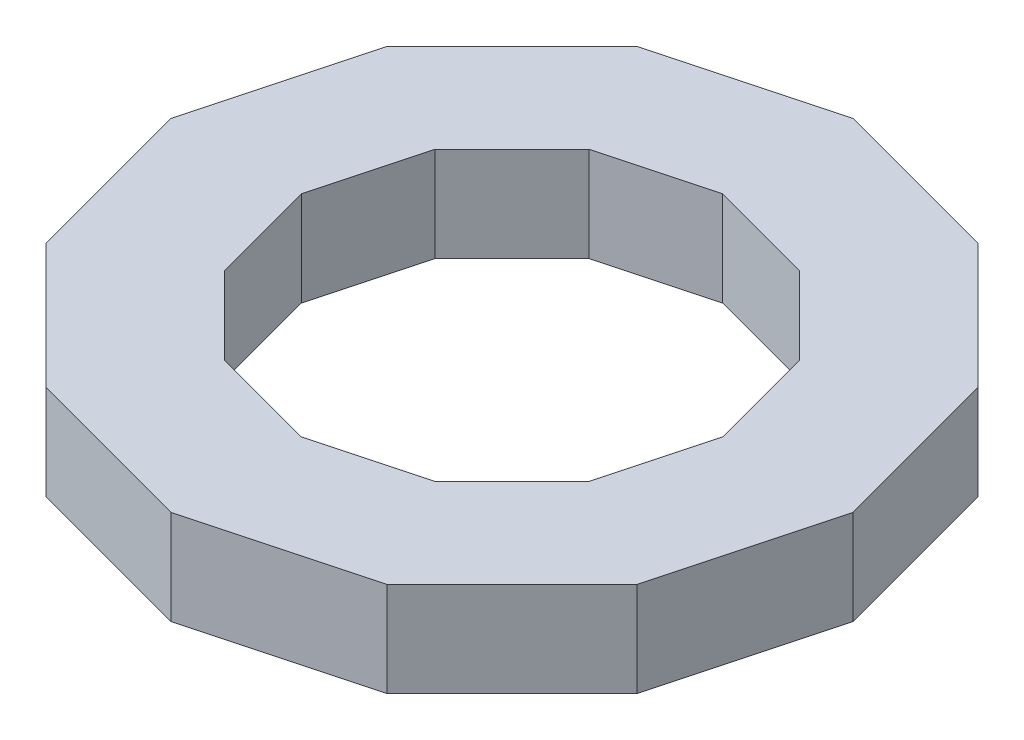
ISO-10303-21;
HEADER;
FILE_DESCRIPTION(('STEP AP214'),'2;1');
FILE_NAME('part.step','',(''),(''),'','','');
FILE_SCHEMA(('AUTOMOTIVE_DESIGN { 1 0 10303 214 1 1 1 1 }'));
ENDSEC;
DATA;
#1=APPLICATION_CONTEXT('core data for automotive mechanical design processes');
#2=APPLICATION_PROTOCOL_DEFINITION('international standard','automotive_design',2000,#1);
#3=PRODUCT_CONTEXT('',#1,'mechanical');
#4=PRODUCT('Part','Part','',(#3));
#5=PRODUCT_RELATED_PRODUCT_CATEGORY('part','',(#4));
#6=PRODUCT_DEFINITION_FORMATION('','',#4);
#7=PRODUCT_DEFINITION_CONTEXT('part definition',#1,'design');
#8=PRODUCT_DEFINITION('design','',#6,#7);
#9=PRODUCT_DEFINITION_SHAPE('','',#8);
#10=(LENGTH_UNIT() NAMED_UNIT(*) SI_UNIT(.MILLI.,.METRE.));
#11=(NAMED_UNIT(*) PLANE_ANGLE_UNIT() SI_UNIT($,.RADIAN.));
#12=(NAMED_UNIT(*) SI_UNIT($,.STERADIAN.) SOLID_ANGLE_UNIT());
#13=UNCERTAINTY_MEASURE_WITH_UNIT(LENGTH_MEASURE(1.E-05),#10,'distance_accuracy_value','');
#14=(GEOMETRIC_REPRESENTATION_CONTEXT(3) GLOBAL_UNCERTAINTY_ASSIGNED_CONTEXT((#13)) GLOBAL_UNIT_ASSIGNED_CONTEXT((#10,
#11,#12)) REPRESENTATION_CONTEXT('',''));
#15=CARTESIAN_POINT('',(0.,0.,0.));
#16=DIRECTION('',(0.,0.,1.));
#17=DIRECTION('',(1.,0.,0.));
#18=AXIS2_PLACEMENT_3D('',#15,#16,#17);
#19=CARTESIAN_POINT('',(0.,19.05,0.));
#20=DIRECTION('',(0.,1.,0.));
#21=DIRECTION('',(0.,0.,1.));
#22=AXIS2_PLACEMENT_3D('',#19,#20,#21);
#23=PLANE('',#22);
#24=DIRECTION('',(0.258819045102522,0.,-0.965925826289068));
#25=VECTOR('',#24,1.);
#26=CARTESIAN_POINT('',(59.4930395218329,19.05,34.3483223828394));
#27=LINE('',#26,#25);
#28=CARTESIAN_POINT('',(59.4930395218329,19.05,34.3483223828394));
#29=VERTEX_POINT('',#28);
#30=CARTESIAN_POINT('',(68.6966447656785,19.05,0.));
#31=VERTEX_POINT('',#30);
#32=EDGE_CURVE('E310',#29,#31,#27,.T.);
#33=ORIENTED_EDGE('',*,*,#32,.T.);
#34=DIRECTION('',(-0.258819045102519,0.,-0.965925826289069));
#35=VECTOR('',#34,1.);
#36=CARTESIAN_POINT('',(68.6966447656785,19.05,0.));
#37=LINE('',#36,#35);
#38=CARTESIAN_POINT('',(59.4930395218329,19.05,-34.3483223828392));
#39=VERTEX_POINT('',#38);
#40=EDGE_CURVE('E313',#31,#39,#37,.T.);
#41=ORIENTED_EDGE('',*,*,#40,.T.);
#42=DIRECTION('',(-0.707106781186547,0.,-0.707106781186548));
#43=VECTOR('',#42,1.);
#44=CARTESIAN_POINT('',(59.4930395218329,19.05,-34.3483223828392));
#45=LINE('',#44,#43);
#46=CARTESIAN_POINT('',(34.3483223828392,19.05,-59.493039521833));
#47=VERTEX_POINT('',#46);
#48=EDGE_CURVE('E317',#39,#47,#45,.T.);
#49=ORIENTED_EDGE('',*,*,#48,.T.);
#50=DIRECTION('',(-0.965925826289068,0.,-0.258819045102521));
#51=VECTOR('',#50,1.);
#52=CARTESIAN_POINT('',(34.3483223828392,19.05,-59.493039521833));
#53=LINE('',#52,#51);
#54=CARTESIAN_POINT('',(0.,19.05,-68.6966447656786));
#55=VERTEX_POINT('',#54);
#56=EDGE_CURVE('E319',#47,#55,#53,.T.);
#57=ORIENTED_EDGE('',*,*,#56,.T.);
#58=DIRECTION('',(-0.965925826289069,0.,0.25881904510252));
#59=VECTOR('',#58,1.);
#60=CARTESIAN_POINT('',(0.,19.05,-68.6966447656786));
#61=LINE('',#60,#59);
#62=CARTESIAN_POINT('',(-34.3483223828393,19.05,-59.493039521833));
#63=VERTEX_POINT('',#62);
#64=EDGE_CURVE('E322',#55,#63,#61,.T.);
#65=ORIENTED_EDGE('',*,*,#64,.T.);
#66=DIRECTION('',(-0.707106781186548,0.,0.707106781186547));
#67=VECTOR('',#66,1.);
#68=CARTESIAN_POINT('',(-34.3483223828393,19.05,-59.493039521833));
#69=LINE('',#68,#67);
#70=CARTESIAN_POINT('',(-59.4930395218329,19.05,-34.3483223828394));
#71=VERTEX_POINT('',#70);
#72=EDGE_CURVE('E325',#63,#71,#69,.T.);
#73=ORIENTED_EDGE('',*,*,#72,.T.);
#74=DIRECTION('',(-0.258819045102522,0.,0.965925826289068));
#75=VECTOR('',#74,1.);
#76=CARTESIAN_POINT('',(-59.4930395218329,19.05,-34.3483223828394));
#77=LINE('',#76,#75);
#78=CARTESIAN_POINT('',(-68.6966447656786,19.05,0.));
#79=VERTEX_POINT('',#78);
#80=EDGE_CURVE('E328',#71,#79,#77,.T.);
#81=ORIENTED_EDGE('',*,*,#80,.T.);
#82=DIRECTION('',(0.25881904510252,0.,0.965925826289069));
#83=VECTOR('',#82,1.);
#84=CARTESIAN_POINT('',(-68.6966447656786,19.05,0.));
#85=LINE('',#84,#83);
#86=CARTESIAN_POINT('',(-59.493039521833,19.05,34.3483223828392));
#87=VERTEX_POINT('',#86);
#88=EDGE_CURVE('E331',#79,#87,#85,.T.);
#89=ORIENTED_EDGE('',*,*,#88,.T.);
#90=DIRECTION('',(0.707106781186547,0.,0.707106781186548));
#91=VECTOR('',#90,1.);
#92=CARTESIAN_POINT('',(-59.493039521833,19.05,34.3483223828392));
#93=LINE('',#92,#91);
#94=CARTESIAN_POINT('',(-34.3483223828393,19.05,59.4930395218329));
#95=VERTEX_POINT('',#94);
#96=EDGE_CURVE('E333',#87,#95,#93,.T.);
#97=ORIENTED_EDGE('',*,*,#96,.T.);
#98=DIRECTION('',(0.965925826289068,0.,0.258819045102522));
#99=VECTOR('',#98,1.);
#100=CARTESIAN_POINT('',(-34.3483223828393,19.05,59.4930395218329));
#101=LINE('',#100,#99);
#102=CARTESIAN_POINT('',(-1.30936471077162E-13,19.05,68.6966447656786));
#103=VERTEX_POINT('',#102);
#104=EDGE_CURVE('E336',#95,#103,#101,.T.);
#105=ORIENTED_EDGE('',*,*,#104,.T.);
#106=DIRECTION('',(0.965925826289069,0.,-0.258819045102519));
#107=VECTOR('',#106,1.);
#108=CARTESIAN_POINT('',(-1.30936471077162E-13,19.05,68.6966447656786));
#109=LINE('',#108,#107);
#110=CARTESIAN_POINT('',(34.3483223828392,19.05,59.493039521833));
#111=VERTEX_POINT('',#110);
#112=EDGE_CURVE('E339',#103,#111,#109,.T.);
#113=ORIENTED_EDGE('',*,*,#112,.T.);
#114=DIRECTION('',(0.707106781186548,0.,-0.707106781186547));
#115=VECTOR('',#114,1.);
#116=CARTESIAN_POINT('',(34.3483223828392,19.05,59.493039521833));
#117=LINE('',#116,#115);
#118=EDGE_CURVE('E341',#111,#29,#117,.T.);
#119=ORIENTED_EDGE('',*,*,#118,.T.);
#120=EDGE_LOOP('',(#33,#41,#49,#57,#65,#73,#81,#89,#97,#105,#113,#119));
#121=FACE_BOUND('',#120,.T.);
#122=DIRECTION('',(-0.25881904510252,0.,-0.965925826289069));
#123=VECTOR('',#122,1.);
#124=CARTESIAN_POINT('',(42.4006297832624,19.05,0.));
#125=LINE('',#124,#123);
#126=CARTESIAN_POINT('',(42.4006297832624,19.05,0.));
#127=VERTEX_POINT('',#126);
#128=CARTESIAN_POINT('',(36.7200225287644,19.05,-21.2003148916311));
#129=VERTEX_POINT('',#128);
#130=EDGE_CURVE('E205',#127,#129,#125,.T.);
#131=ORIENTED_EDGE('',*,*,#130,.F.);
#132=DIRECTION('',(0.258819045102521,0.,-0.965925826289068));
#133=VECTOR('',#132,1.);
#134=CARTESIAN_POINT('',(36.7200225287643,19.05,21.2003148916312));
#135=LINE('',#134,#133);
#136=CARTESIAN_POINT('',(36.7200225287643,19.05,21.2003148916312));
#137=VERTEX_POINT('',#136);
#138=EDGE_CURVE('E196',#137,#127,#135,.T.);
#139=ORIENTED_EDGE('',*,*,#138,.F.);
#140=DIRECTION('',(0.707106781186548,0.,-0.707106781186547));
#141=VECTOR('',#140,1.);
#142=CARTESIAN_POINT('',(21.2003148916311,19.05,36.7200225287644));
#143=LINE('',#142,#141);
#144=CARTESIAN_POINT('',(21.2003148916312,19.05,36.7200225287644));
#145=VERTEX_POINT('',#144);
#146=EDGE_CURVE('E248',#145,#137,#143,.T.);
#147=ORIENTED_EDGE('',*,*,#146,.F.);
#148=DIRECTION('',(0.965925826289069,0.,-0.25881904510252));
#149=VECTOR('',#148,1.);
#150=CARTESIAN_POINT('',(0.,19.05,42.4006297832624));
#151=LINE('',#150,#149);
#152=CARTESIAN_POINT('',(0.,19.05,42.4006297832624));
#153=VERTEX_POINT('',#152);
#154=EDGE_CURVE('E245',#153,#145,#151,.T.);
#155=ORIENTED_EDGE('',*,*,#154,.F.);
#156=DIRECTION('',(0.965925826289068,0.,0.258819045102522));
#157=VECTOR('',#156,1.);
#158=CARTESIAN_POINT('',(-21.2003148916313,19.05,36.7200225287643));
#159=LINE('',#158,#157);
#160=CARTESIAN_POINT('',(-21.2003148916313,19.05,36.7200225287643));
#161=VERTEX_POINT('',#160);
#162=EDGE_CURVE('E242',#161,#153,#159,.T.);
#163=ORIENTED_EDGE('',*,*,#162,.F.);
#164=DIRECTION('',(0.707106781186547,0.,0.707106781186548));
#165=VECTOR('',#164,1.);
#166=CARTESIAN_POINT('',(-36.7200225287644,19.05,21.2003148916312));
#167=LINE('',#166,#165);
#168=CARTESIAN_POINT('',(-36.7200225287644,19.05,21.2003148916312));
#169=VERTEX_POINT('',#168);
#170=EDGE_CURVE('E240',#169,#161,#167,.T.);
#171=ORIENTED_EDGE('',*,*,#170,.F.);
#172=DIRECTION('',(0.25881904510252,0.,0.965925826289069));
#173=VECTOR('',#172,1.);
#174=CARTESIAN_POINT('',(-42.4006297832625,19.05,0.));
#175=LINE('',#174,#173);
#176=CARTESIAN_POINT('',(-42.4006297832625,19.05,0.));
#177=VERTEX_POINT('',#176);
#178=EDGE_CURVE('E237',#177,#169,#175,.T.);
#179=ORIENTED_EDGE('',*,*,#178,.F.);
#180=DIRECTION('',(-0.258819045102521,0.,0.965925826289068));
#181=VECTOR('',#180,1.);
#182=CARTESIAN_POINT('',(-36.7200225287644,19.05,-21.2003148916313));
#183=LINE('',#182,#181);
#184=CARTESIAN_POINT('',(-36.7200225287644,19.05,-21.2003148916313));
#185=VERTEX_POINT('',#184);
#186=EDGE_CURVE('E234',#185,#177,#183,.T.);
#187=ORIENTED_EDGE('',*,*,#186,.F.);
#188=DIRECTION('',(-0.707106781186548,0.,0.707106781186547));
#189=VECTOR('',#188,1.);
#190=CARTESIAN_POINT('',(-21.2003148916312,19.05,-36.7200225287644));
#191=LINE('',#190,#189);
#192=CARTESIAN_POINT('',(-21.2003148916312,19.05,-36.7200225287644));
#193=VERTEX_POINT('',#192);
#194=EDGE_CURVE('E232',#193,#185,#191,.T.);
#195=ORIENTED_EDGE('',*,*,#194,.F.);
#196=DIRECTION('',(-0.965925826289068,0.,0.25881904510252));
#197=VECTOR('',#196,1.);
#198=CARTESIAN_POINT('',(0.,19.05,-42.4006297832625));
#199=LINE('',#198,#197);
#200=CARTESIAN_POINT('',(0.,19.05,-42.4006297832625));
#201=VERTEX_POINT('',#200);
#202=EDGE_CURVE('E229',#201,#193,#199,.T.);
#203=ORIENTED_EDGE('',*,*,#202,.F.);
#204=DIRECTION('',(-0.965925826289068,0.,-0.258819045102521));
#205=VECTOR('',#204,1.);
#206=CARTESIAN_POINT('',(21.2003148916311,19.05,-36.7200225287645));
#207=LINE('',#206,#205);
#208=CARTESIAN_POINT('',(21.2003148916311,19.05,-36.7200225287645));
#209=VERTEX_POINT('',#208);
#210=EDGE_CURVE('E224',#209,#201,#207,.T.);
#211=ORIENTED_EDGE('',*,*,#210,.F.);
#212=DIRECTION('',(-0.707106781186547,0.,-0.707106781186548));
#213=VECTOR('',#212,1.);
#214=CARTESIAN_POINT('',(36.7200225287644,19.05,-21.2003148916311));
#215=LINE('',#214,#213);
#216=EDGE_CURVE('E218',#129,#209,#215,.T.);
#217=ORIENTED_EDGE('',*,*,#216,.F.);
#218=EDGE_LOOP('',(#131,#139,#147,#155,#163,#171,#179,#187,#195,#203,#211,#217));
#219=FACE_BOUND('',#218,.T.);
#220=ADVANCED_FACE('F35',(#121,#219),#23,.T.);
#221=CARTESIAN_POINT('',(0.,0.,0.));
#222=DIRECTION('',(0.,1.,0.));
#223=DIRECTION('',(0.,0.,1.));
#224=AXIS2_PLACEMENT_3D('',#221,#222,#223);
#225=PLANE('',#224);
#226=DIRECTION('',(0.258819045102522,0.,-0.965925826289068));
#227=VECTOR('',#226,1.);
#228=CARTESIAN_POINT('',(59.4930395218329,0.,34.3483223828394));
#229=LINE('',#228,#227);
#230=CARTESIAN_POINT('',(59.4930395218329,0.,34.3483223828394));
#231=VERTEX_POINT('',#230);
#232=CARTESIAN_POINT('',(68.6966447656785,0.,0.));
#233=VERTEX_POINT('',#232);
#234=EDGE_CURVE('E213',#231,#233,#229,.T.);
#235=ORIENTED_EDGE('',*,*,#234,.F.);
#236=DIRECTION('',(0.707106781186548,0.,-0.707106781186547));
#237=VECTOR('',#236,1.);
#238=CARTESIAN_POINT('',(34.3483223828392,0.,59.493039521833));
#239=LINE('',#238,#237);
#240=CARTESIAN_POINT('',(34.3483223828392,0.,59.493039521833));
#241=VERTEX_POINT('',#240);
#242=EDGE_CURVE('E314',#241,#231,#239,.T.);
#243=ORIENTED_EDGE('',*,*,#242,.F.);
#244=DIRECTION('',(0.965925826289069,0.,-0.258819045102519));
#245=VECTOR('',#244,1.);
#246=CARTESIAN_POINT('',(-1.30936471077162E-13,0.,68.6966447656786));
#247=LINE('',#246,#245);
#248=CARTESIAN_POINT('',(-1.30936471077162E-13,0.,68.6966447656786));
#249=VERTEX_POINT('',#248);
#250=EDGE_CURVE('E373',#249,#241,#247,.T.);
#251=ORIENTED_EDGE('',*,*,#250,.F.);
#252=DIRECTION('',(0.965925826289068,0.,0.258819045102522));
#253=VECTOR('',#252,1.);
#254=CARTESIAN_POINT('',(-34.3483223828393,0.,59.4930395218329));
#255=LINE('',#254,#253);
#256=CARTESIAN_POINT('',(-34.3483223828393,0.,59.4930395218329));
#257=VERTEX_POINT('',#256);
#258=EDGE_CURVE('E370',#257,#249,#255,.T.);
#259=ORIENTED_EDGE('',*,*,#258,.F.);
#260=DIRECTION('',(0.707106781186547,0.,0.707106781186548));
#261=VECTOR('',#260,1.);
#262=CARTESIAN_POINT('',(-59.493039521833,0.,34.3483223828392));
#263=LINE('',#262,#261);
#264=CARTESIAN_POINT('',(-59.493039521833,0.,34.3483223828392));
#265=VERTEX_POINT('',#264);
#266=EDGE_CURVE('E367',#265,#257,#263,.T.);
#267=ORIENTED_EDGE('',*,*,#266,.F.);
#268=DIRECTION('',(0.25881904510252,0.,0.965925826289069));
#269=VECTOR('',#268,1.);
#270=CARTESIAN_POINT('',(-68.6966447656786,0.,0.));
#271=LINE('',#270,#269);
#272=CARTESIAN_POINT('',(-68.6966447656786,0.,0.));
#273=VERTEX_POINT('',#272);
#274=EDGE_CURVE('E364',#273,#265,#271,.T.);
#275=ORIENTED_EDGE('',*,*,#274,.F.);
#276=DIRECTION('',(-0.258819045102522,0.,0.965925826289068));
#277=VECTOR('',#276,1.);
#278=CARTESIAN_POINT('',(-59.4930395218329,0.,-34.3483223828394));
#279=LINE('',#278,#277);
#280=CARTESIAN_POINT('',(-59.4930395218329,0.,-34.3483223828394));
#281=VERTEX_POINT('',#280);
#282=EDGE_CURVE('E362',#281,#273,#279,.T.);
#283=ORIENTED_EDGE('',*,*,#282,.F.);
#284=DIRECTION('',(-0.707106781186548,0.,0.707106781186547));
#285=VECTOR('',#284,1.);
#286=CARTESIAN_POINT('',(-34.3483223828393,0.,-59.493039521833));
#287=LINE('',#286,#285);
#288=CARTESIAN_POINT('',(-34.3483223828393,0.,-59.493039521833));
#289=VERTEX_POINT('',#288);
#290=EDGE_CURVE('E359',#289,#281,#287,.T.);
#291=ORIENTED_EDGE('',*,*,#290,.F.);
#292=DIRECTION('',(-0.965925826289069,0.,0.25881904510252));
#293=VECTOR('',#292,1.);
#294=CARTESIAN_POINT('',(0.,0.,-68.6966447656786));
#295=LINE('',#294,#293);
#296=CARTESIAN_POINT('',(0.,0.,-68.6966447656786));
#297=VERTEX_POINT('',#296);
#298=EDGE_CURVE('E356',#297,#289,#295,.T.);
#299=ORIENTED_EDGE('',*,*,#298,.F.);
#300=DIRECTION('',(-0.965925826289068,0.,-0.258819045102521));
#301=VECTOR('',#300,1.);
#302=CARTESIAN_POINT('',(34.3483223828392,0.,-59.493039521833));
#303=LINE('',#302,#301);
#304=CARTESIAN_POINT('',(34.3483223828392,0.,-59.493039521833));
#305=VERTEX_POINT('',#304);
#306=EDGE_CURVE('E354',#305,#297,#303,.T.);
#307=ORIENTED_EDGE('',*,*,#306,.F.);
#308=DIRECTION('',(-0.707106781186547,0.,-0.707106781186548));
#309=VECTOR('',#308,1.);
#310=CARTESIAN_POINT('',(59.4930395218329,0.,-34.3483223828392));
#311=LINE('',#310,#309);
#312=CARTESIAN_POINT('',(59.4930395218329,0.,-34.3483223828392));
#313=VERTEX_POINT('',#312);
#314=EDGE_CURVE('E351',#313,#305,#311,.T.);
#315=ORIENTED_EDGE('',*,*,#314,.F.);
#316=DIRECTION('',(-0.258819045102519,0.,-0.965925826289069));
#317=VECTOR('',#316,1.);
#318=CARTESIAN_POINT('',(68.6966447656785,0.,0.));
#319=LINE('',#318,#317);
#320=EDGE_CURVE('E348',#233,#313,#319,.T.);
#321=ORIENTED_EDGE('',*,*,#320,.F.);
#322=EDGE_LOOP('',(#235,#243,#251,#259,#267,#275,#283,#291,#299,#307,#315,#321));
#323=FACE_BOUND('',#322,.T.);
#324=DIRECTION('',(0.258819045102521,0.,-0.965925826289068));
#325=VECTOR('',#324,1.);
#326=CARTESIAN_POINT('',(36.7200225287643,0.,21.2003148916312));
#327=LINE('',#326,#325);
#328=CARTESIAN_POINT('',(36.7200225287643,0.,21.2003148916312));
#329=VERTEX_POINT('',#328);
#330=CARTESIAN_POINT('',(42.4006297832624,0.,0.));
#331=VERTEX_POINT('',#330);
#332=EDGE_CURVE('E58',#329,#331,#327,.T.);
#333=ORIENTED_EDGE('',*,*,#332,.T.);
#334=DIRECTION('',(-0.25881904510252,0.,-0.965925826289069));
#335=VECTOR('',#334,1.);
#336=CARTESIAN_POINT('',(42.4006297832624,0.,0.));
#337=LINE('',#336,#335);
#338=CARTESIAN_POINT('',(36.7200225287644,0.,-21.2003148916311));
#339=VERTEX_POINT('',#338);
#340=EDGE_CURVE('E212',#331,#339,#337,.T.);
#341=ORIENTED_EDGE('',*,*,#340,.T.);
#342=DIRECTION('',(-0.707106781186547,0.,-0.707106781186548));
#343=VECTOR('',#342,1.);
#344=CARTESIAN_POINT('',(36.7200225287644,0.,-21.2003148916311));
#345=LINE('',#344,#343);
#346=CARTESIAN_POINT('',(21.2003148916311,0.,-36.7200225287645));
#347=VERTEX_POINT('',#346);
#348=EDGE_CURVE('E254',#339,#347,#345,.T.);
#349=ORIENTED_EDGE('',*,*,#348,.T.);
#350=DIRECTION('',(-0.965925826289068,0.,-0.258819045102521));
#351=VECTOR('',#350,1.);
#352=CARTESIAN_POINT('',(21.2003148916311,0.,-36.7200225287645));
#353=LINE('',#352,#351);
#354=CARTESIAN_POINT('',(0.,0.,-42.4006297832625));
#355=VERTEX_POINT('',#354);
#356=EDGE_CURVE('E257',#347,#355,#353,.T.);
#357=ORIENTED_EDGE('',*,*,#356,.T.);
#358=DIRECTION('',(-0.965925826289068,0.,0.25881904510252));
#359=VECTOR('',#358,1.);
#360=CARTESIAN_POINT('',(0.,0.,-42.4006297832625));
#361=LINE('',#360,#359);
#362=CARTESIAN_POINT('',(-21.2003148916312,0.,-36.7200225287644));
#363=VERTEX_POINT('',#362);
#364=EDGE_CURVE('E261',#355,#363,#361,.T.);
#365=ORIENTED_EDGE('',*,*,#364,.T.);
#366=DIRECTION('',(-0.707106781186548,0.,0.707106781186547));
#367=VECTOR('',#366,1.);
#368=CARTESIAN_POINT('',(-21.2003148916312,0.,-36.7200225287644));
#369=LINE('',#368,#367);
#370=CARTESIAN_POINT('',(-36.7200225287644,0.,-21.2003148916313));
#371=VERTEX_POINT('',#370);
#372=EDGE_CURVE('E265',#363,#371,#369,.T.);
#373=ORIENTED_EDGE('',*,*,#372,.T.);
#374=DIRECTION('',(-0.258819045102521,0.,0.965925826289068));
#375=VECTOR('',#374,1.);
#376=CARTESIAN_POINT('',(-36.7200225287644,0.,-21.2003148916313));
#377=LINE('',#376,#375);
#378=CARTESIAN_POINT('',(-42.4006297832625,0.,0.));
#379=VERTEX_POINT('',#378);
#380=EDGE_CURVE('E268',#371,#379,#377,.T.);
#381=ORIENTED_EDGE('',*,*,#380,.T.);
#382=DIRECTION('',(0.25881904510252,0.,0.965925826289069));
#383=VECTOR('',#382,1.);
#384=CARTESIAN_POINT('',(-42.4006297832625,0.,0.));
#385=LINE('',#384,#383);
#386=CARTESIAN_POINT('',(-36.7200225287644,0.,21.2003148916312));
#387=VERTEX_POINT('',#386);
#388=EDGE_CURVE('E272',#379,#387,#385,.T.);
#389=ORIENTED_EDGE('',*,*,#388,.T.);
#390=DIRECTION('',(0.707106781186547,0.,0.707106781186548));
#391=VECTOR('',#390,1.);
#392=CARTESIAN_POINT('',(-36.7200225287644,0.,21.2003148916312));
#393=LINE('',#392,#391);
#394=CARTESIAN_POINT('',(-21.2003148916313,0.,36.7200225287643));
#395=VERTEX_POINT('',#394);
#396=EDGE_CURVE('E276',#387,#395,#393,.T.);
#397=ORIENTED_EDGE('',*,*,#396,.T.);
#398=DIRECTION('',(0.965925826289068,0.,0.258819045102522));
#399=VECTOR('',#398,1.);
#400=CARTESIAN_POINT('',(-21.2003148916313,0.,36.7200225287643));
#401=LINE('',#400,#399);
#402=CARTESIAN_POINT('',(0.,0.,42.4006297832624));
#403=VERTEX_POINT('',#402);
#404=EDGE_CURVE('E279',#395,#403,#401,.T.);
#405=ORIENTED_EDGE('',*,*,#404,.T.);
#406=DIRECTION('',(0.965925826289069,0.,-0.25881904510252));
#407=VECTOR('',#406,1.);
#408=CARTESIAN_POINT('',(0.,0.,42.4006297832624));
#409=LINE('',#408,#407);
#410=CARTESIAN_POINT('',(21.2003148916311,0.,36.7200225287644));
#411=VERTEX_POINT('',#410);
#412=EDGE_CURVE('E282',#403,#411,#409,.T.);
#413=ORIENTED_EDGE('',*,*,#412,.T.);
#414=DIRECTION('',(0.707106781186548,0.,-0.707106781186547));
#415=VECTOR('',#414,1.);
#416=CARTESIAN_POINT('',(21.2003148916311,0.,36.7200225287644));
#417=LINE('',#416,#415);
#418=EDGE_CURVE('E206',#411,#329,#417,.T.);
#419=ORIENTED_EDGE('',*,*,#418,.T.);
#420=EDGE_LOOP('',(#333,#341,#349,#357,#365,#373,#381,#389,#397,#405,#413,#419));
#421=FACE_BOUND('',#420,.T.);
#422=ADVANCED_FACE('F419',(#323,#421),#225,.F.);
#423=CARTESIAN_POINT('',(59.4930395218329,19.05,34.3483223828394));
#424=DIRECTION('',(-0.965925826289068,0.,-0.258819045102522));
#425=DIRECTION('',(-0.258819045102522,0.,0.965925826289068));
#426=AXIS2_PLACEMENT_3D('',#423,#424,#425);
#427=PLANE('',#426);
#428=ORIENTED_EDGE('',*,*,#234,.T.);
#429=DIRECTION('',(0.,-1.,0.));
#430=VECTOR('',#429,1.);
#431=CARTESIAN_POINT('',(68.6966447656785,19.05,0.));
#432=LINE('',#431,#430);
#433=EDGE_CURVE('E11',#31,#233,#432,.T.);
#434=ORIENTED_EDGE('',*,*,#433,.F.);
#435=ORIENTED_EDGE('',*,*,#32,.F.);
#436=DIRECTION('',(0.,-1.,0.));
#437=VECTOR('',#436,1.);
#438=CARTESIAN_POINT('',(59.4930395218329,19.05,34.3483223828394));
#439=LINE('',#438,#437);
#440=EDGE_CURVE('E344',#29,#231,#439,.T.);
#441=ORIENTED_EDGE('',*,*,#440,.T.);
#442=EDGE_LOOP('',(#428,#434,#435,#441));
#443=FACE_BOUND('',#442,.T.);
#444=ADVANCED_FACE('F37',(#443),#427,.F.);
#445=CARTESIAN_POINT('',(68.6966447656785,19.05,0.));
#446=DIRECTION('',(-0.965925826289069,0.,0.258819045102519));
#447=DIRECTION('',(0.25881904510252,0.,0.965925826289069));
#448=AXIS2_PLACEMENT_3D('',#445,#446,#447);
#449=PLANE('',#448);
#450=ORIENTED_EDGE('',*,*,#320,.T.);
#451=DIRECTION('',(0.,-1.,0.));
#452=VECTOR('',#451,1.);
#453=CARTESIAN_POINT('',(59.4930395218329,19.05,-34.3483223828392));
#454=LINE('',#453,#452);
#455=EDGE_CURVE('E43',#39,#313,#454,.T.);
#456=ORIENTED_EDGE('',*,*,#455,.F.);
#457=ORIENTED_EDGE('',*,*,#40,.F.);
#458=ORIENTED_EDGE('',*,*,#433,.T.);
#459=EDGE_LOOP('',(#450,#456,#457,#458));
#460=FACE_BOUND('',#459,.T.);
#461=ADVANCED_FACE('F436',(#460),#449,.F.);
#462=CARTESIAN_POINT('',(59.4930395218329,19.05,-34.3483223828392));
#463=DIRECTION('',(-0.707106781186548,0.,0.707106781186547));
#464=DIRECTION('',(0.707106781186547,0.,0.707106781186548));
#465=AXIS2_PLACEMENT_3D('',#462,#463,#464);
#466=PLANE('',#465);
#467=ORIENTED_EDGE('',*,*,#314,.T.);
#468=DIRECTION('',(0.,-1.,0.));
#469=VECTOR('',#468,1.);
#470=CARTESIAN_POINT('',(34.3483223828392,19.05,-59.493039521833));
#471=LINE('',#470,#469);
#472=EDGE_CURVE('E406',#47,#305,#471,.T.);
#473=ORIENTED_EDGE('',*,*,#472,.F.);
#474=ORIENTED_EDGE('',*,*,#48,.F.);
#475=ORIENTED_EDGE('',*,*,#455,.T.);
#476=EDGE_LOOP('',(#467,#473,#474,#475));
#477=FACE_BOUND('',#476,.T.);
#478=ADVANCED_FACE('F413',(#477),#466,.F.);
#479=CARTESIAN_POINT('',(34.3483223828392,19.05,-59.493039521833));
#480=DIRECTION('',(-0.258819045102521,0.,0.965925826289068));
#481=DIRECTION('',(0.965925826289068,0.,0.258819045102521));
#482=AXIS2_PLACEMENT_3D('',#479,#480,#481);
#483=PLANE('',#482);
#484=ORIENTED_EDGE('',*,*,#306,.T.);
#485=DIRECTION('',(0.,-1.,0.));
#486=VECTOR('',#485,1.);
#487=CARTESIAN_POINT('',(0.,19.05,-68.6966447656786));
#488=LINE('',#487,#486);
#489=EDGE_CURVE('E403',#55,#297,#488,.T.);
#490=ORIENTED_EDGE('',*,*,#489,.F.);
#491=ORIENTED_EDGE('',*,*,#56,.F.);
#492=ORIENTED_EDGE('',*,*,#472,.T.);
#493=EDGE_LOOP('',(#484,#490,#491,#492));
#494=FACE_BOUND('',#493,.T.);
#495=ADVANCED_FACE('F425',(#494),#483,.F.);
#496=CARTESIAN_POINT('',(0.,19.05,-68.6966447656786));
#497=DIRECTION('',(0.25881904510252,0.,0.965925826289069));
#498=DIRECTION('',(0.965925826289069,0.,-0.25881904510252));
#499=AXIS2_PLACEMENT_3D('',#496,#497,#498);
#500=PLANE('',#499);
#501=ORIENTED_EDGE('',*,*,#298,.T.);
#502=DIRECTION('',(0.,-1.,0.));
#503=VECTOR('',#502,1.);
#504=CARTESIAN_POINT('',(-34.3483223828393,19.05,-59.493039521833));
#505=LINE('',#504,#503);
#506=EDGE_CURVE('E400',#63,#289,#505,.T.);
#507=ORIENTED_EDGE('',*,*,#506,.F.);
#508=ORIENTED_EDGE('',*,*,#64,.F.);
#509=ORIENTED_EDGE('',*,*,#489,.T.);
#510=EDGE_LOOP('',(#501,#507,#508,#509));
#511=FACE_BOUND('',#510,.T.);
#512=ADVANCED_FACE('F429',(#511),#500,.F.);
#513=CARTESIAN_POINT('',(-34.3483223828393,19.05,-59.493039521833));
#514=DIRECTION('',(0.707106781186547,0.,0.707106781186548));
#515=DIRECTION('',(0.707106781186548,0.,-0.707106781186547));
#516=AXIS2_PLACEMENT_3D('',#513,#514,#515);
#517=PLANE('',#516);
#518=ORIENTED_EDGE('',*,*,#290,.T.);
#519=DIRECTION('',(0.,-1.,0.));
#520=VECTOR('',#519,1.);
#521=CARTESIAN_POINT('',(-59.4930395218329,19.05,-34.3483223828394));
#522=LINE('',#521,#520);
#523=EDGE_CURVE('E396',#71,#281,#522,.T.);
#524=ORIENTED_EDGE('',*,*,#523,.F.);
#525=ORIENTED_EDGE('',*,*,#72,.F.);
#526=ORIENTED_EDGE('',*,*,#506,.T.);
#527=EDGE_LOOP('',(#518,#524,#525,#526));
#528=FACE_BOUND('',#527,.T.);
#529=ADVANCED_FACE('F469',(#528),#517,.F.);
#530=CARTESIAN_POINT('',(-59.4930395218329,19.05,-34.3483223828394));
#531=DIRECTION('',(0.965925826289068,0.,0.258819045102522));
#532=DIRECTION('',(0.258819045102522,0.,-0.965925826289068));
#533=AXIS2_PLACEMENT_3D('',#530,#531,#532);
#534=PLANE('',#533);
#535=ORIENTED_EDGE('',*,*,#282,.T.);
#536=DIRECTION('',(0.,-1.,0.));
#537=VECTOR('',#536,1.);
#538=CARTESIAN_POINT('',(-68.6966447656786,19.05,0.));
#539=LINE('',#538,#537);
#540=EDGE_CURVE('E393',#79,#273,#539,.T.);
#541=ORIENTED_EDGE('',*,*,#540,.F.);
#542=ORIENTED_EDGE('',*,*,#80,.F.);
#543=ORIENTED_EDGE('',*,*,#523,.T.);
#544=EDGE_LOOP('',(#535,#541,#542,#543));
#545=FACE_BOUND('',#544,.T.);
#546=ADVANCED_FACE('F467',(#545),#534,.F.);
#547=CARTESIAN_POINT('',(-68.6966447656786,19.05,0.));
#548=DIRECTION('',(0.965925826289069,0.,-0.25881904510252));
#549=DIRECTION('',(-0.25881904510252,0.,-0.965925826289069));
#550=AXIS2_PLACEMENT_3D('',#547,#548,#549);
#551=PLANE('',#550);
#552=ORIENTED_EDGE('',*,*,#274,.T.);
#553=DIRECTION('',(0.,-1.,0.));
#554=VECTOR('',#553,1.);
#555=CARTESIAN_POINT('',(-59.493039521833,19.05,34.3483223828392));
#556=LINE('',#555,#554);
#557=EDGE_CURVE('E390',#87,#265,#556,.T.);
#558=ORIENTED_EDGE('',*,*,#557,.F.);
#559=ORIENTED_EDGE('',*,*,#88,.F.);
#560=ORIENTED_EDGE('',*,*,#540,.T.);
#561=EDGE_LOOP('',(#552,#558,#559,#560));
#562=FACE_BOUND('',#561,.T.);
#563=ADVANCED_FACE('F463',(#562),#551,.F.);
#564=CARTESIAN_POINT('',(-59.493039521833,19.05,34.3483223828392));
#565=DIRECTION('',(0.707106781186548,0.,-0.707106781186547));
#566=DIRECTION('',(-0.707106781186547,0.,-0.707106781186548));
#567=AXIS2_PLACEMENT_3D('',#564,#565,#566);
#568=PLANE('',#567);
#569=ORIENTED_EDGE('',*,*,#266,.T.);
#570=DIRECTION('',(0.,-1.,0.));
#571=VECTOR('',#570,1.);
#572=CARTESIAN_POINT('',(-34.3483223828393,19.05,59.4930395218329));
#573=LINE('',#572,#571);
#574=EDGE_CURVE('E386',#95,#257,#573,.T.);
#575=ORIENTED_EDGE('',*,*,#574,.F.);
#576=ORIENTED_EDGE('',*,*,#96,.F.);
#577=ORIENTED_EDGE('',*,*,#557,.T.);
#578=EDGE_LOOP('',(#569,#575,#576,#577));
#579=FACE_BOUND('',#578,.T.);
#580=ADVANCED_FACE('F458',(#579),#568,.F.);
#581=CARTESIAN_POINT('',(-34.3483223828393,19.05,59.4930395218329));
#582=DIRECTION('',(0.258819045102522,0.,-0.965925826289068));
#583=DIRECTION('',(-0.965925826289068,0.,-0.258819045102522));
#584=AXIS2_PLACEMENT_3D('',#581,#582,#583);
#585=PLANE('',#584);
#586=ORIENTED_EDGE('',*,*,#258,.T.);
#587=DIRECTION('',(0.,-1.,0.));
#588=VECTOR('',#587,1.);
#589=CARTESIAN_POINT('',(-1.30936471077162E-13,19.05,68.6966447656786));
#590=LINE('',#589,#588);
#591=EDGE_CURVE('E383',#103,#249,#590,.T.);
#592=ORIENTED_EDGE('',*,*,#591,.F.);
#593=ORIENTED_EDGE('',*,*,#104,.F.);
#594=ORIENTED_EDGE('',*,*,#574,.T.);
#595=EDGE_LOOP('',(#586,#592,#593,#594));
#596=FACE_BOUND('',#595,.T.);
#597=ADVANCED_FACE('F452',(#596),#585,.F.);
#598=CARTESIAN_POINT('',(-1.30936471077162E-13,19.05,68.6966447656786));
#599=DIRECTION('',(-0.258819045102519,0.,-0.965925826289069));
#600=DIRECTION('',(-0.965925826289069,0.,0.258819045102519));
#601=AXIS2_PLACEMENT_3D('',#598,#599,#600);
#602=PLANE('',#601);
#603=ORIENTED_EDGE('',*,*,#250,.T.);
#604=DIRECTION('',(0.,-1.,0.));
#605=VECTOR('',#604,1.);
#606=CARTESIAN_POINT('',(34.3483223828392,19.05,59.493039521833));
#607=LINE('',#606,#605);
#608=EDGE_CURVE('E380',#111,#241,#607,.T.);
#609=ORIENTED_EDGE('',*,*,#608,.F.);
#610=ORIENTED_EDGE('',*,*,#112,.F.);
#611=ORIENTED_EDGE('',*,*,#591,.T.);
#612=EDGE_LOOP('',(#603,#609,#610,#611));
#613=FACE_BOUND('',#612,.T.);
#614=ADVANCED_FACE('F448',(#613),#602,.F.);
#615=CARTESIAN_POINT('',(34.3483223828392,19.05,59.493039521833));
#616=DIRECTION('',(-0.707106781186547,0.,-0.707106781186548));
#617=DIRECTION('',(-0.707106781186548,0.,0.707106781186547));
#618=AXIS2_PLACEMENT_3D('',#615,#616,#617);
#619=PLANE('',#618);
#620=ORIENTED_EDGE('',*,*,#242,.T.);
#621=ORIENTED_EDGE('',*,*,#440,.F.);
#622=ORIENTED_EDGE('',*,*,#118,.F.);
#623=ORIENTED_EDGE('',*,*,#608,.T.);
#624=EDGE_LOOP('',(#620,#621,#622,#623));
#625=FACE_BOUND('',#624,.T.);
#626=ADVANCED_FACE('F443',(#625),#619,.F.);
#627=CARTESIAN_POINT('',(36.7200225287643,19.05,21.2003148916312));
#628=DIRECTION('',(-0.965925826289068,0.,-0.258819045102521));
#629=DIRECTION('',(-0.258819045102521,0.,0.965925826289068));
#630=AXIS2_PLACEMENT_3D('',#627,#628,#629);
#631=PLANE('',#630);
#632=ORIENTED_EDGE('',*,*,#332,.F.);
#633=DIRECTION('',(0.,-1.,0.));
#634=VECTOR('',#633,1.);
#635=CARTESIAN_POINT('',(36.7200225287643,19.05,21.2003148916312));
#636=LINE('',#635,#634);
#637=EDGE_CURVE('E200',#137,#329,#636,.T.);
#638=ORIENTED_EDGE('',*,*,#637,.F.);
#639=ORIENTED_EDGE('',*,*,#138,.T.);
#640=DIRECTION('',(0.,-1.,0.));
#641=VECTOR('',#640,1.);
#642=CARTESIAN_POINT('',(42.4006297832624,19.05,0.));
#643=LINE('',#642,#641);
#644=EDGE_CURVE('E199',#127,#331,#643,.T.);
#645=ORIENTED_EDGE('',*,*,#644,.T.);
#646=EDGE_LOOP('',(#632,#638,#639,#645));
#647=FACE_BOUND('',#646,.T.);
#648=ADVANCED_FACE('F198',(#647),#631,.T.);
#649=CARTESIAN_POINT('',(42.4006297832624,19.05,0.));
#650=DIRECTION('',(-0.965925826289068,0.,0.25881904510252));
#651=DIRECTION('',(0.25881904510252,0.,0.965925826289069));
#652=AXIS2_PLACEMENT_3D('',#649,#650,#651);
#653=PLANE('',#652);
#654=ORIENTED_EDGE('',*,*,#340,.F.);
#655=ORIENTED_EDGE('',*,*,#644,.F.);
#656=ORIENTED_EDGE('',*,*,#130,.T.);
#657=DIRECTION('',(0.,-1.,0.));
#658=VECTOR('',#657,1.);
#659=CARTESIAN_POINT('',(36.7200225287644,19.05,-21.2003148916311));
#660=LINE('',#659,#658);
#661=EDGE_CURVE('E214',#129,#339,#660,.T.);
#662=ORIENTED_EDGE('',*,*,#661,.T.);
#663=EDGE_LOOP('',(#654,#655,#656,#662));
#664=FACE_BOUND('',#663,.T.);
#665=ADVANCED_FACE('F209',(#664),#653,.T.);
#666=CARTESIAN_POINT('',(36.7200225287644,19.05,-21.2003148916311));
#667=DIRECTION('',(-0.707106781186548,0.,0.707106781186547));
#668=DIRECTION('',(0.707106781186547,0.,0.707106781186548));
#669=AXIS2_PLACEMENT_3D('',#666,#667,#668);
#670=PLANE('',#669);
#671=ORIENTED_EDGE('',*,*,#348,.F.);
#672=ORIENTED_EDGE('',*,*,#661,.F.);
#673=ORIENTED_EDGE('',*,*,#216,.T.);
#674=DIRECTION('',(0.,-1.,0.));
#675=VECTOR('',#674,1.);
#676=CARTESIAN_POINT('',(21.2003148916311,19.05,-36.7200225287645));
#677=LINE('',#676,#675);
#678=EDGE_CURVE('E307',#209,#347,#677,.T.);
#679=ORIENTED_EDGE('',*,*,#678,.T.);
#680=EDGE_LOOP('',(#671,#672,#673,#679));
#681=FACE_BOUND('',#680,.T.);
#682=ADVANCED_FACE('F527',(#681),#670,.T.);
#683=CARTESIAN_POINT('',(21.2003148916311,19.05,-36.7200225287645));
#684=DIRECTION('',(-0.258819045102521,0.,0.965925826289068));
#685=DIRECTION('',(0.965925826289068,0.,0.258819045102521));
#686=AXIS2_PLACEMENT_3D('',#683,#684,#685);
#687=PLANE('',#686);
#688=ORIENTED_EDGE('',*,*,#356,.F.);
#689=ORIENTED_EDGE('',*,*,#678,.F.);
#690=ORIENTED_EDGE('',*,*,#210,.T.);
#691=DIRECTION('',(0.,-1.,0.));
#692=VECTOR('',#691,1.);
#693=CARTESIAN_POINT('',(0.,19.05,-42.4006297832625));
#694=LINE('',#693,#692);
#695=EDGE_CURVE('E305',#201,#355,#694,.T.);
#696=ORIENTED_EDGE('',*,*,#695,.T.);
#697=EDGE_LOOP('',(#688,#689,#690,#696));
#698=FACE_BOUND('',#697,.T.);
#699=ADVANCED_FACE('F533',(#698),#687,.T.);
#700=CARTESIAN_POINT('',(0.,19.05,-42.4006297832625));
#701=DIRECTION('',(0.25881904510252,0.,0.965925826289069));
#702=DIRECTION('',(0.965925826289069,0.,-0.25881904510252));
#703=AXIS2_PLACEMENT_3D('',#700,#701,#702);
#704=PLANE('',#703);
#705=ORIENTED_EDGE('',*,*,#364,.F.);
#706=ORIENTED_EDGE('',*,*,#695,.F.);
#707=ORIENTED_EDGE('',*,*,#202,.T.);
#708=DIRECTION('',(0.,-1.,0.));
#709=VECTOR('',#708,1.);
#710=CARTESIAN_POINT('',(-21.2003148916312,19.05,-36.7200225287644));
#711=LINE('',#710,#709);
#712=EDGE_CURVE('E303',#193,#363,#711,.T.);
#713=ORIENTED_EDGE('',*,*,#712,.T.);
#714=EDGE_LOOP('',(#705,#706,#707,#713));
#715=FACE_BOUND('',#714,.T.);
#716=ADVANCED_FACE('F541',(#715),#704,.T.);
#717=CARTESIAN_POINT('',(-21.2003148916312,19.05,-36.7200225287644));
#718=DIRECTION('',(0.707106781186547,0.,0.707106781186548));
#719=DIRECTION('',(0.707106781186548,0.,-0.707106781186547));
#720=AXIS2_PLACEMENT_3D('',#717,#718,#719);
#721=PLANE('',#720);
#722=ORIENTED_EDGE('',*,*,#372,.F.);
#723=ORIENTED_EDGE('',*,*,#712,.F.);
#724=ORIENTED_EDGE('',*,*,#194,.T.);
#725=DIRECTION('',(0.,-1.,0.));
#726=VECTOR('',#725,1.);
#727=CARTESIAN_POINT('',(-36.7200225287644,19.05,-21.2003148916313));
#728=LINE('',#727,#726);
#729=EDGE_CURVE('E300',#185,#371,#728,.T.);
#730=ORIENTED_EDGE('',*,*,#729,.T.);
#731=EDGE_LOOP('',(#722,#723,#724,#730));
#732=FACE_BOUND('',#731,.T.);
#733=ADVANCED_FACE('F549',(#732),#721,.T.);
#734=CARTESIAN_POINT('',(-36.7200225287644,19.05,-21.2003148916313));
#735=DIRECTION('',(0.965925826289068,0.,0.258819045102521));
#736=DIRECTION('',(0.258819045102521,0.,-0.965925826289068));
#737=AXIS2_PLACEMENT_3D('',#734,#735,#736);
#738=PLANE('',#737);
#739=ORIENTED_EDGE('',*,*,#380,.F.);
#740=ORIENTED_EDGE('',*,*,#729,.F.);
#741=ORIENTED_EDGE('',*,*,#186,.T.);
#742=DIRECTION('',(0.,-1.,0.));
#743=VECTOR('',#742,1.);
#744=CARTESIAN_POINT('',(-42.4006297832625,19.05,0.));
#745=LINE('',#744,#743);
#746=EDGE_CURVE('E298',#177,#379,#745,.T.);
#747=ORIENTED_EDGE('',*,*,#746,.T.);
#748=EDGE_LOOP('',(#739,#740,#741,#747));
#749=FACE_BOUND('',#748,.T.);
#750=ADVANCED_FACE('F556',(#749),#738,.T.);
#751=CARTESIAN_POINT('',(-42.4006297832625,19.05,0.));
#752=DIRECTION('',(0.965925826289069,0.,-0.25881904510252));
#753=DIRECTION('',(-0.25881904510252,0.,-0.965925826289069));
#754=AXIS2_PLACEMENT_3D('',#751,#752,#753);
#755=PLANE('',#754);
#756=ORIENTED_EDGE('',*,*,#388,.F.);
#757=ORIENTED_EDGE('',*,*,#746,.F.);
#758=ORIENTED_EDGE('',*,*,#178,.T.);
#759=DIRECTION('',(0.,-1.,0.));
#760=VECTOR('',#759,1.);
#761=CARTESIAN_POINT('',(-36.7200225287644,19.05,21.2003148916312));
#762=LINE('',#761,#760);
#763=EDGE_CURVE('E296',#169,#387,#762,.T.);
#764=ORIENTED_EDGE('',*,*,#763,.T.);
#765=EDGE_LOOP('',(#756,#757,#758,#764));
#766=FACE_BOUND('',#765,.T.);
#767=ADVANCED_FACE('F564',(#766),#755,.T.);
#768=CARTESIAN_POINT('',(-36.7200225287644,19.05,21.2003148916312));
#769=DIRECTION('',(0.707106781186548,0.,-0.707106781186547));
#770=DIRECTION('',(-0.707106781186547,0.,-0.707106781186548));
#771=AXIS2_PLACEMENT_3D('',#768,#769,#770);
#772=PLANE('',#771);
#773=ORIENTED_EDGE('',*,*,#396,.F.);
#774=ORIENTED_EDGE('',*,*,#763,.F.);
#775=ORIENTED_EDGE('',*,*,#170,.T.);
#776=DIRECTION('',(0.,-1.,0.));
#777=VECTOR('',#776,1.);
#778=CARTESIAN_POINT('',(-21.2003148916313,19.05,36.7200225287643));
#779=LINE('',#778,#777);
#780=EDGE_CURVE('E294',#161,#395,#779,.T.);
#781=ORIENTED_EDGE('',*,*,#780,.T.);
#782=EDGE_LOOP('',(#773,#774,#775,#781));
#783=FACE_BOUND('',#782,.T.);
#784=ADVANCED_FACE('F573',(#783),#772,.T.);
#785=CARTESIAN_POINT('',(-21.2003148916313,19.05,36.7200225287643));
#786=DIRECTION('',(0.258819045102522,0.,-0.965925826289068));
#787=DIRECTION('',(-0.965925826289068,0.,-0.258819045102522));
#788=AXIS2_PLACEMENT_3D('',#785,#786,#787);
#789=PLANE('',#788);
#790=ORIENTED_EDGE('',*,*,#404,.F.);
#791=ORIENTED_EDGE('',*,*,#780,.F.);
#792=ORIENTED_EDGE('',*,*,#162,.T.);
#793=DIRECTION('',(0.,-1.,0.));
#794=VECTOR('',#793,1.);
#795=CARTESIAN_POINT('',(0.,19.05,42.4006297832624));
#796=LINE('',#795,#794);
#797=EDGE_CURVE('E292',#153,#403,#796,.T.);
#798=ORIENTED_EDGE('',*,*,#797,.T.);
#799=EDGE_LOOP('',(#790,#791,#792,#798));
#800=FACE_BOUND('',#799,.T.);
#801=ADVANCED_FACE('F580',(#800),#789,.T.);
#802=CARTESIAN_POINT('',(0.,19.05,42.4006297832624));
#803=DIRECTION('',(-0.25881904510252,0.,-0.965925826289069));
#804=DIRECTION('',(-0.965925826289069,0.,0.25881904510252));
#805=AXIS2_PLACEMENT_3D('',#802,#803,#804);
#806=PLANE('',#805);
#807=ORIENTED_EDGE('',*,*,#412,.F.);
#808=ORIENTED_EDGE('',*,*,#797,.F.);
#809=ORIENTED_EDGE('',*,*,#154,.T.);
#810=DIRECTION('',(0.,-1.,0.));
#811=VECTOR('',#810,1.);
#812=CARTESIAN_POINT('',(21.2003148916311,19.05,36.7200225287644));
#813=LINE('',#812,#811);
#814=EDGE_CURVE('E50',#145,#411,#813,.T.);
#815=ORIENTED_EDGE('',*,*,#814,.T.);
#816=EDGE_LOOP('',(#807,#808,#809,#815));
#817=FACE_BOUND('',#816,.T.);
#818=ADVANCED_FACE('F588',(#817),#806,.T.);
#819=CARTESIAN_POINT('',(21.2003148916311,19.05,36.7200225287644));
#820=DIRECTION('',(-0.707106781186547,0.,-0.707106781186548));
#821=DIRECTION('',(-0.707106781186548,0.,0.707106781186547));
#822=AXIS2_PLACEMENT_3D('',#819,#820,#821);
#823=PLANE('',#822);
#824=ORIENTED_EDGE('',*,*,#418,.F.);
#825=ORIENTED_EDGE('',*,*,#814,.F.);
#826=ORIENTED_EDGE('',*,*,#146,.T.);
#827=ORIENTED_EDGE('',*,*,#637,.T.);
#828=EDGE_LOOP('',(#824,#825,#826,#827));
#829=FACE_BOUND('',#828,.T.);
#830=ADVANCED_FACE('F596',(#829),#823,.T.);
#831=CLOSED_SHELL('',(#220,#422,#444,#461,#478,#495,#512,#529,#546,#563,#580,#597,#614,#626,
#648,#665,#682,#699,#716,#733,#750,#767,#784,#801,#818,#830));
#832=MANIFOLD_SOLID_BREP('B2',#831);
#833=ADVANCED_BREP_SHAPE_REPRESENTATION('',(#18,#832),#14);
#834=SHAPE_DEFINITION_REPRESENTATION(#9,#833);
ENDSEC;
END-ISO-10303-21;
